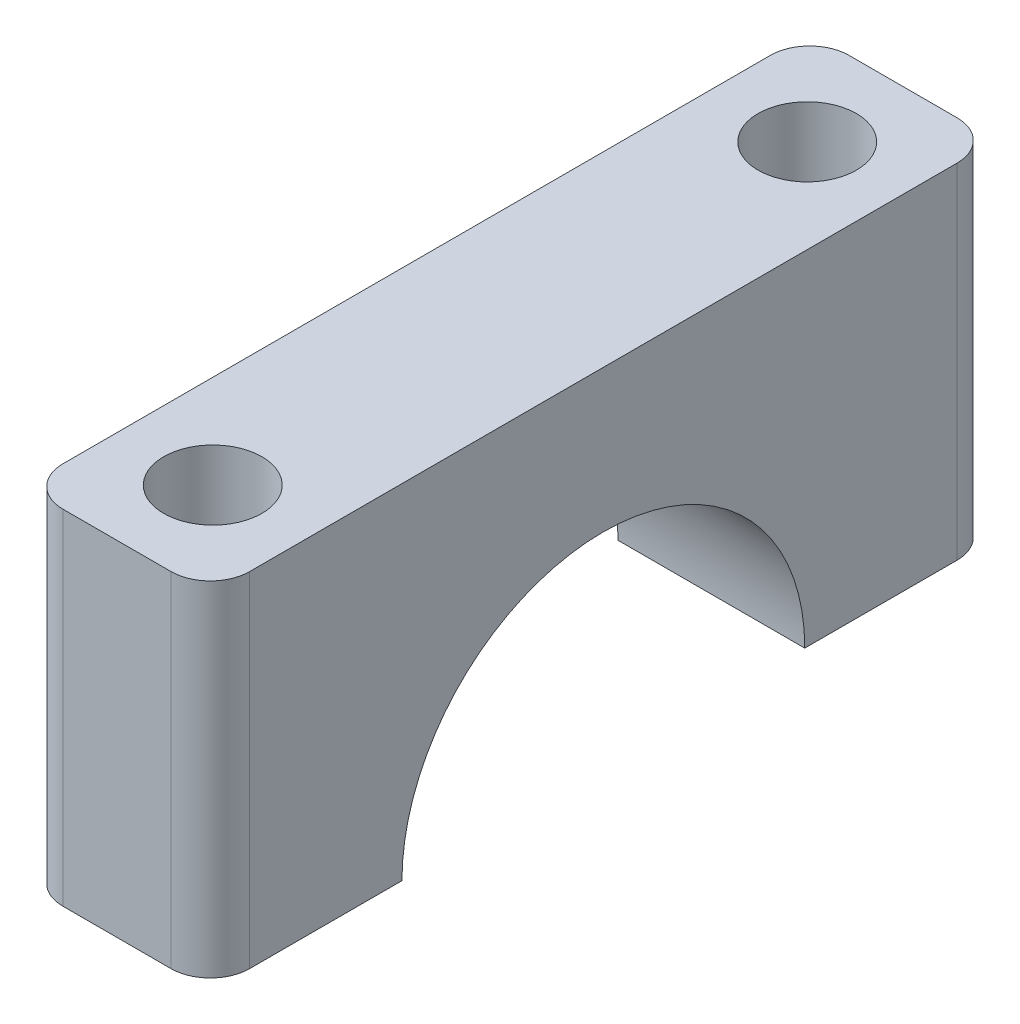
ISO-10303-21;
HEADER;
FILE_DESCRIPTION(('STEP AP214'),'2;1');
FILE_NAME('part.step','',(''),(''),'','','');
FILE_SCHEMA(('AUTOMOTIVE_DESIGN { 1 0 10303 214 1 1 1 1 }'));
ENDSEC;
DATA;
#1=APPLICATION_CONTEXT('core data for automotive mechanical design processes');
#2=APPLICATION_PROTOCOL_DEFINITION('international standard','automotive_design',2000,#1);
#3=PRODUCT_CONTEXT('',#1,'mechanical');
#4=PRODUCT('Part','Part','',(#3));
#5=PRODUCT_RELATED_PRODUCT_CATEGORY('part','',(#4));
#6=PRODUCT_DEFINITION_FORMATION('','',#4);
#7=PRODUCT_DEFINITION_CONTEXT('part definition',#1,'design');
#8=PRODUCT_DEFINITION('design','',#6,#7);
#9=PRODUCT_DEFINITION_SHAPE('','',#8);
#10=(LENGTH_UNIT() NAMED_UNIT(*) SI_UNIT(.MILLI.,.METRE.));
#11=(NAMED_UNIT(*) PLANE_ANGLE_UNIT() SI_UNIT($,.RADIAN.));
#12=(NAMED_UNIT(*) SI_UNIT($,.STERADIAN.) SOLID_ANGLE_UNIT());
#13=UNCERTAINTY_MEASURE_WITH_UNIT(LENGTH_MEASURE(1.E-05),#10,'distance_accuracy_value','');
#14=(GEOMETRIC_REPRESENTATION_CONTEXT(3) GLOBAL_UNCERTAINTY_ASSIGNED_CONTEXT((#13)) GLOBAL_UNIT_ASSIGNED_CONTEXT((#10,
#11,#12)) REPRESENTATION_CONTEXT('',''));
#15=CARTESIAN_POINT('',(0.,0.,0.));
#16=DIRECTION('',(0.,0.,1.));
#17=DIRECTION('',(1.,0.,0.));
#18=AXIS2_PLACEMENT_3D('',#15,#16,#17);
#19=CARTESIAN_POINT('',(0.,0.,0.));
#20=DIRECTION('',(0.,-1.,0.));
#21=DIRECTION('',(0.,0.,-1.));
#22=AXIS2_PLACEMENT_3D('',#19,#20,#21);
#23=PLANE('',#22);
#24=CARTESIAN_POINT('',(0.,0.,-30.25));
#25=DIRECTION('',(0.,-1.,0.));
#26=DIRECTION('',(0.,0.,-1.));
#27=AXIS2_PLACEMENT_3D('',#24,#25,#26);
#28=CIRCLE('',#27,5.);
#29=CARTESIAN_POINT('',(0.,0.,-35.25));
#30=VERTEX_POINT('',#29);
#31=EDGE_CURVE('E288',#30,#30,#28,.T.);
#32=ORIENTED_EDGE('',*,*,#31,.F.);
#33=EDGE_LOOP('',(#32));
#34=FACE_BOUND('',#33,.T.);
#35=DIRECTION('',(0.,0.,1.));
#36=VECTOR('',#35,1.);
#37=CARTESIAN_POINT('',(-9.5,0.,40.));
#38=LINE('',#37,#36);
#39=CARTESIAN_POINT('',(-9.5,0.,-36.));
#40=VERTEX_POINT('',#39);
#41=CARTESIAN_POINT('',(-9.5,0.,-20.5));
#42=VERTEX_POINT('',#41);
#43=EDGE_CURVE('E161',#40,#42,#38,.T.);
#44=ORIENTED_EDGE('',*,*,#43,.F.);
#45=CARTESIAN_POINT('',(-5.5,0.,-36.));
#46=DIRECTION('',(0.,-1.,0.));
#47=DIRECTION('',(0.,0.,-1.));
#48=AXIS2_PLACEMENT_3D('',#45,#46,#47);
#49=CIRCLE('',#48,4.);
#50=CARTESIAN_POINT('',(-5.5,0.,-40.));
#51=VERTEX_POINT('',#50);
#52=EDGE_CURVE('E61',#40,#51,#49,.T.);
#53=ORIENTED_EDGE('',*,*,#52,.T.);
#54=DIRECTION('',(-1.,0.,0.));
#55=VECTOR('',#54,1.);
#56=CARTESIAN_POINT('',(-9.5,0.,-40.));
#57=LINE('',#56,#55);
#58=CARTESIAN_POINT('',(5.5,0.,-40.));
#59=VERTEX_POINT('',#58);
#60=EDGE_CURVE('E152',#59,#51,#57,.T.);
#61=ORIENTED_EDGE('',*,*,#60,.F.);
#62=CARTESIAN_POINT('',(5.5,0.,-36.));
#63=DIRECTION('',(0.,-1.,0.));
#64=DIRECTION('',(0.,0.,-1.));
#65=AXIS2_PLACEMENT_3D('',#62,#63,#64);
#66=CIRCLE('',#65,4.);
#67=CARTESIAN_POINT('',(9.5,0.,-36.));
#68=VERTEX_POINT('',#67);
#69=EDGE_CURVE('E69',#59,#68,#66,.T.);
#70=ORIENTED_EDGE('',*,*,#69,.T.);
#71=DIRECTION('',(0.,0.,-1.));
#72=VECTOR('',#71,1.);
#73=CARTESIAN_POINT('',(9.5,0.,40.));
#74=LINE('',#73,#72);
#75=CARTESIAN_POINT('',(9.5,0.,-20.5));
#76=VERTEX_POINT('',#75);
#77=EDGE_CURVE('E141',#76,#68,#74,.T.);
#78=ORIENTED_EDGE('',*,*,#77,.F.);
#79=DIRECTION('',(1.,0.,0.));
#80=VECTOR('',#79,1.);
#81=CARTESIAN_POINT('',(-25.5,0.,-20.5));
#82=LINE('',#81,#80);
#83=EDGE_CURVE('E125',#42,#76,#82,.T.);
#84=ORIENTED_EDGE('',*,*,#83,.F.);
#85=EDGE_LOOP('',(#44,#53,#61,#70,#78,#84));
#86=FACE_BOUND('',#85,.T.);
#87=ADVANCED_FACE('F45',(#34,#86),#23,.T.);
#88=CARTESIAN_POINT('',(9.5,35.,40.));
#89=DIRECTION('',(-1.,0.,0.));
#90=DIRECTION('',(0.,0.,1.));
#91=AXIS2_PLACEMENT_3D('',#88,#89,#90);
#92=PLANE('',#91);
#93=DIRECTION('',(0.,0.,-1.));
#94=VECTOR('',#93,1.);
#95=CARTESIAN_POINT('',(9.5,35.,40.));
#96=LINE('',#95,#94);
#97=CARTESIAN_POINT('',(9.5,35.,36.));
#98=VERTEX_POINT('',#97);
#99=CARTESIAN_POINT('',(9.5,35.,-36.));
#100=VERTEX_POINT('',#99);
#101=EDGE_CURVE('E168',#98,#100,#96,.T.);
#102=ORIENTED_EDGE('',*,*,#101,.F.);
#103=DIRECTION('',(0.,-1.,0.));
#104=VECTOR('',#103,1.);
#105=CARTESIAN_POINT('',(9.5,35.,36.));
#106=LINE('',#105,#104);
#107=CARTESIAN_POINT('',(9.5,0.,36.));
#108=VERTEX_POINT('',#107);
#109=EDGE_CURVE('E173',#98,#108,#106,.T.);
#110=ORIENTED_EDGE('',*,*,#109,.T.);
#111=CARTESIAN_POINT('',(9.5,0.,20.5));
#112=VERTEX_POINT('',#111);
#113=EDGE_CURVE('E144',#108,#112,#74,.T.);
#114=ORIENTED_EDGE('',*,*,#113,.T.);
#115=CARTESIAN_POINT('',(9.5,0.,0.));
#116=DIRECTION('',(1.,0.,0.));
#117=DIRECTION('',(0.,0.,-1.));
#118=AXIS2_PLACEMENT_3D('',#115,#116,#117);
#119=CIRCLE('',#118,20.5);
#120=EDGE_CURVE('E128',#76,#112,#119,.T.);
#121=ORIENTED_EDGE('',*,*,#120,.F.);
#122=ORIENTED_EDGE('',*,*,#77,.T.);
#123=DIRECTION('',(0.,-1.,0.));
#124=VECTOR('',#123,1.);
#125=CARTESIAN_POINT('',(9.5,35.,-36.));
#126=LINE('',#125,#124);
#127=EDGE_CURVE('E134',#68,#100,#126,.F.);
#128=ORIENTED_EDGE('',*,*,#127,.T.);
#129=EDGE_LOOP('',(#102,#110,#114,#121,#122,#128));
#130=FACE_BOUND('',#129,.T.);
#131=ADVANCED_FACE('F140',(#130),#92,.F.);
#132=CARTESIAN_POINT('',(-9.5,35.,-40.));
#133=DIRECTION('',(0.,0.,1.));
#134=DIRECTION('',(1.,0.,0.));
#135=AXIS2_PLACEMENT_3D('',#132,#133,#134);
#136=PLANE('',#135);
#137=ORIENTED_EDGE('',*,*,#60,.T.);
#138=DIRECTION('',(0.,-1.,0.));
#139=VECTOR('',#138,1.);
#140=CARTESIAN_POINT('',(-5.5,35.,-40.));
#141=LINE('',#140,#139);
#142=CARTESIAN_POINT('',(-5.5,35.,-40.));
#143=VERTEX_POINT('',#142);
#144=EDGE_CURVE('E11',#51,#143,#141,.F.);
#145=ORIENTED_EDGE('',*,*,#144,.T.);
#146=DIRECTION('',(-1.,0.,0.));
#147=VECTOR('',#146,1.);
#148=CARTESIAN_POINT('',(-9.5,35.,-40.));
#149=LINE('',#148,#147);
#150=CARTESIAN_POINT('',(5.5,35.,-40.));
#151=VERTEX_POINT('',#150);
#152=EDGE_CURVE('E217',#151,#143,#149,.T.);
#153=ORIENTED_EDGE('',*,*,#152,.F.);
#154=DIRECTION('',(0.,-1.,0.));
#155=VECTOR('',#154,1.);
#156=CARTESIAN_POINT('',(5.5,35.,-40.));
#157=LINE('',#156,#155);
#158=EDGE_CURVE('E54',#151,#59,#157,.T.);
#159=ORIENTED_EDGE('',*,*,#158,.T.);
#160=EDGE_LOOP('',(#137,#145,#153,#159));
#161=FACE_BOUND('',#160,.T.);
#162=ADVANCED_FACE('F214',(#161),#136,.F.);
#163=CARTESIAN_POINT('',(-9.5,35.,40.));
#164=DIRECTION('',(1.,0.,0.));
#165=DIRECTION('',(0.,0.,-1.));
#166=AXIS2_PLACEMENT_3D('',#163,#164,#165);
#167=PLANE('',#166);
#168=CARTESIAN_POINT('',(-9.5,0.,20.5));
#169=VERTEX_POINT('',#168);
#170=CARTESIAN_POINT('',(-9.5,0.,36.));
#171=VERTEX_POINT('',#170);
#172=EDGE_CURVE('E160',#169,#171,#38,.T.);
#173=ORIENTED_EDGE('',*,*,#172,.T.);
#174=DIRECTION('',(0.,-1.,0.));
#175=VECTOR('',#174,1.);
#176=CARTESIAN_POINT('',(-9.5,35.,36.));
#177=LINE('',#176,#175);
#178=CARTESIAN_POINT('',(-9.5,35.,36.));
#179=VERTEX_POINT('',#178);
#180=EDGE_CURVE('E205',#171,#179,#177,.F.);
#181=ORIENTED_EDGE('',*,*,#180,.T.);
#182=DIRECTION('',(0.,0.,1.));
#183=VECTOR('',#182,1.);
#184=CARTESIAN_POINT('',(-9.5,35.,40.));
#185=LINE('',#184,#183);
#186=CARTESIAN_POINT('',(-9.5,35.,-36.));
#187=VERTEX_POINT('',#186);
#188=EDGE_CURVE('E229',#187,#179,#185,.T.);
#189=ORIENTED_EDGE('',*,*,#188,.F.);
#190=DIRECTION('',(0.,-1.,0.));
#191=VECTOR('',#190,1.);
#192=CARTESIAN_POINT('',(-9.5,35.,-36.));
#193=LINE('',#192,#191);
#194=EDGE_CURVE('E201',#187,#40,#193,.T.);
#195=ORIENTED_EDGE('',*,*,#194,.T.);
#196=ORIENTED_EDGE('',*,*,#43,.T.);
#197=CARTESIAN_POINT('',(-9.5,0.,0.));
#198=DIRECTION('',(1.,0.,0.));
#199=DIRECTION('',(0.,0.,-1.));
#200=AXIS2_PLACEMENT_3D('',#197,#198,#199);
#201=CIRCLE('',#200,20.5);
#202=EDGE_CURVE('E131',#42,#169,#201,.T.);
#203=ORIENTED_EDGE('',*,*,#202,.T.);
#204=EDGE_LOOP('',(#173,#181,#189,#195,#196,#203));
#205=FACE_BOUND('',#204,.T.);
#206=ADVANCED_FACE('F248',(#205),#167,.F.);
#207=CARTESIAN_POINT('',(-9.5,35.,40.));
#208=DIRECTION('',(0.,0.,-1.));
#209=DIRECTION('',(-1.,0.,0.));
#210=AXIS2_PLACEMENT_3D('',#207,#208,#209);
#211=PLANE('',#210);
#212=DIRECTION('',(1.,0.,0.));
#213=VECTOR('',#212,1.);
#214=CARTESIAN_POINT('',(-9.5,0.,40.));
#215=LINE('',#214,#213);
#216=CARTESIAN_POINT('',(-5.5,0.,40.));
#217=VERTEX_POINT('',#216);
#218=CARTESIAN_POINT('',(5.5,0.,40.));
#219=VERTEX_POINT('',#218);
#220=EDGE_CURVE('E164',#217,#219,#215,.T.);
#221=ORIENTED_EDGE('',*,*,#220,.T.);
#222=DIRECTION('',(0.,-1.,0.));
#223=VECTOR('',#222,1.);
#224=CARTESIAN_POINT('',(5.5,35.,40.));
#225=LINE('',#224,#223);
#226=CARTESIAN_POINT('',(5.5,35.,40.));
#227=VERTEX_POINT('',#226);
#228=EDGE_CURVE('E186',#219,#227,#225,.F.);
#229=ORIENTED_EDGE('',*,*,#228,.T.);
#230=DIRECTION('',(1.,0.,0.));
#231=VECTOR('',#230,1.);
#232=CARTESIAN_POINT('',(-9.5,35.,40.));
#233=LINE('',#232,#231);
#234=CARTESIAN_POINT('',(-5.5,35.,40.));
#235=VERTEX_POINT('',#234);
#236=EDGE_CURVE('E156',#235,#227,#233,.T.);
#237=ORIENTED_EDGE('',*,*,#236,.F.);
#238=DIRECTION('',(0.,-1.,0.));
#239=VECTOR('',#238,1.);
#240=CARTESIAN_POINT('',(-5.5,35.,40.));
#241=LINE('',#240,#239);
#242=EDGE_CURVE('E182',#235,#217,#241,.T.);
#243=ORIENTED_EDGE('',*,*,#242,.T.);
#244=EDGE_LOOP('',(#221,#229,#237,#243));
#245=FACE_BOUND('',#244,.T.);
#246=ADVANCED_FACE('F281',(#245),#211,.F.);
#247=CARTESIAN_POINT('',(0.,35.,0.));
#248=DIRECTION('',(0.,-1.,0.));
#249=DIRECTION('',(0.,0.,-1.));
#250=AXIS2_PLACEMENT_3D('',#247,#248,#249);
#251=PLANE('',#250);
#252=CARTESIAN_POINT('',(0.,35.,-30.25));
#253=DIRECTION('',(0.,-1.,0.));
#254=DIRECTION('',(0.,0.,-1.));
#255=AXIS2_PLACEMENT_3D('',#252,#253,#254);
#256=CIRCLE('',#255,5.);
#257=CARTESIAN_POINT('',(0.,35.,-35.25));
#258=VERTEX_POINT('',#257);
#259=EDGE_CURVE('E146',#258,#258,#256,.T.);
#260=ORIENTED_EDGE('',*,*,#259,.T.);
#261=EDGE_LOOP('',(#260));
#262=FACE_BOUND('',#261,.T.);
#263=CARTESIAN_POINT('',(0.,35.,30.25));
#264=DIRECTION('',(0.,-1.,0.));
#265=DIRECTION('',(0.,0.,-1.));
#266=AXIS2_PLACEMENT_3D('',#263,#264,#265);
#267=CIRCLE('',#266,5.);
#268=CARTESIAN_POINT('',(0.,35.,25.25));
#269=VERTEX_POINT('',#268);
#270=EDGE_CURVE('E289',#269,#269,#267,.T.);
#271=ORIENTED_EDGE('',*,*,#270,.T.);
#272=EDGE_LOOP('',(#271));
#273=FACE_BOUND('',#272,.T.);
#274=ORIENTED_EDGE('',*,*,#236,.T.);
#275=CARTESIAN_POINT('',(5.5,35.,36.));
#276=DIRECTION('',(0.,-1.,0.));
#277=DIRECTION('',(0.,0.,-1.));
#278=AXIS2_PLACEMENT_3D('',#275,#276,#277);
#279=CIRCLE('',#278,4.);
#280=EDGE_CURVE('E198',#227,#98,#279,.F.);
#281=ORIENTED_EDGE('',*,*,#280,.T.);
#282=ORIENTED_EDGE('',*,*,#101,.T.);
#283=CARTESIAN_POINT('',(5.5,35.,-36.));
#284=DIRECTION('',(0.,-1.,0.));
#285=DIRECTION('',(0.,0.,-1.));
#286=AXIS2_PLACEMENT_3D('',#283,#284,#285);
#287=CIRCLE('',#286,4.);
#288=EDGE_CURVE('E189',#100,#151,#287,.F.);
#289=ORIENTED_EDGE('',*,*,#288,.T.);
#290=ORIENTED_EDGE('',*,*,#152,.T.);
#291=CARTESIAN_POINT('',(-5.5,35.,-36.));
#292=DIRECTION('',(0.,-1.,0.));
#293=DIRECTION('',(0.,0.,-1.));
#294=AXIS2_PLACEMENT_3D('',#291,#292,#293);
#295=CIRCLE('',#294,4.);
#296=EDGE_CURVE('E192',#143,#187,#295,.F.);
#297=ORIENTED_EDGE('',*,*,#296,.T.);
#298=ORIENTED_EDGE('',*,*,#188,.T.);
#299=CARTESIAN_POINT('',(-5.5,35.,36.));
#300=DIRECTION('',(0.,-1.,0.));
#301=DIRECTION('',(0.,0.,-1.));
#302=AXIS2_PLACEMENT_3D('',#299,#300,#301);
#303=CIRCLE('',#302,4.);
#304=EDGE_CURVE('E195',#179,#235,#303,.F.);
#305=ORIENTED_EDGE('',*,*,#304,.T.);
#306=EDGE_LOOP('',(#274,#281,#282,#289,#290,#297,#298,#305));
#307=FACE_BOUND('',#306,.T.);
#308=ADVANCED_FACE('F222',(#262,#273,#307),#251,.F.);
#309=CARTESIAN_POINT('',(0.,0.,30.25));
#310=DIRECTION('',(0.,-1.,0.));
#311=DIRECTION('',(0.,0.,-1.));
#312=AXIS2_PLACEMENT_3D('',#309,#310,#311);
#313=CIRCLE('',#312,5.);
#314=CARTESIAN_POINT('',(0.,0.,25.25));
#315=VERTEX_POINT('',#314);
#316=EDGE_CURVE('E285',#315,#315,#313,.T.);
#317=ORIENTED_EDGE('',*,*,#316,.F.);
#318=EDGE_LOOP('',(#317));
#319=FACE_BOUND('',#318,.T.);
#320=ORIENTED_EDGE('',*,*,#113,.F.);
#321=CARTESIAN_POINT('',(5.5,0.,36.));
#322=DIRECTION('',(0.,-1.,0.));
#323=DIRECTION('',(0.,0.,-1.));
#324=AXIS2_PLACEMENT_3D('',#321,#322,#323);
#325=CIRCLE('',#324,4.);
#326=EDGE_CURVE('E179',#108,#219,#325,.T.);
#327=ORIENTED_EDGE('',*,*,#326,.T.);
#328=ORIENTED_EDGE('',*,*,#220,.F.);
#329=CARTESIAN_POINT('',(-5.5,0.,36.));
#330=DIRECTION('',(0.,-1.,0.));
#331=DIRECTION('',(0.,0.,-1.));
#332=AXIS2_PLACEMENT_3D('',#329,#330,#331);
#333=CIRCLE('',#332,4.);
#334=EDGE_CURVE('E176',#217,#171,#333,.T.);
#335=ORIENTED_EDGE('',*,*,#334,.T.);
#336=ORIENTED_EDGE('',*,*,#172,.F.);
#337=DIRECTION('',(1.,0.,0.));
#338=VECTOR('',#337,1.);
#339=CARTESIAN_POINT('',(-25.5,0.,20.5));
#340=LINE('',#339,#338);
#341=EDGE_CURVE('E135',#112,#169,#340,.F.);
#342=ORIENTED_EDGE('',*,*,#341,.F.);
#343=EDGE_LOOP('',(#320,#327,#328,#335,#336,#342));
#344=FACE_BOUND('',#343,.T.);
#345=ADVANCED_FACE('F243',(#319,#344),#23,.T.);
#346=CARTESIAN_POINT('',(-25.5,0.,0.));
#347=DIRECTION('',(1.,0.,0.));
#348=DIRECTION('',(0.,0.,-1.));
#349=AXIS2_PLACEMENT_3D('',#346,#347,#348);
#350=CYLINDRICAL_SURFACE('',#349,20.5);
#351=ORIENTED_EDGE('',*,*,#83,.T.);
#352=ORIENTED_EDGE('',*,*,#120,.T.);
#353=ORIENTED_EDGE('',*,*,#341,.T.);
#354=ORIENTED_EDGE('',*,*,#202,.F.);
#355=EDGE_LOOP('',(#351,#352,#353,#354));
#356=FACE_BOUND('',#355,.T.);
#357=ADVANCED_FACE('F127',(#356),#350,.F.);
#358=CARTESIAN_POINT('',(0.,35.,30.25));
#359=DIRECTION('',(0.,-1.,0.));
#360=DIRECTION('',(0.,0.,-1.));
#361=AXIS2_PLACEMENT_3D('',#358,#359,#360);
#362=CYLINDRICAL_SURFACE('',#361,5.);
#363=ORIENTED_EDGE('',*,*,#270,.F.);
#364=EDGE_LOOP('',(#363));
#365=FACE_BOUND('',#364,.T.);
#366=ORIENTED_EDGE('',*,*,#316,.T.);
#367=EDGE_LOOP('',(#366));
#368=FACE_BOUND('',#367,.T.);
#369=ADVANCED_FACE('F279',(#365,#368),#362,.F.);
#370=CARTESIAN_POINT('',(0.,35.,-30.25));
#371=DIRECTION('',(0.,-1.,0.));
#372=DIRECTION('',(0.,0.,-1.));
#373=AXIS2_PLACEMENT_3D('',#370,#371,#372);
#374=CYLINDRICAL_SURFACE('',#373,5.);
#375=ORIENTED_EDGE('',*,*,#259,.F.);
#376=EDGE_LOOP('',(#375));
#377=FACE_BOUND('',#376,.T.);
#378=ORIENTED_EDGE('',*,*,#31,.T.);
#379=EDGE_LOOP('',(#378));
#380=FACE_BOUND('',#379,.T.);
#381=ADVANCED_FACE('F303',(#377,#380),#374,.F.);
#382=CARTESIAN_POINT('',(5.5,35.,36.));
#383=DIRECTION('',(0.,-1.,0.));
#384=DIRECTION('',(0.,0.,-1.));
#385=AXIS2_PLACEMENT_3D('',#382,#383,#384);
#386=CYLINDRICAL_SURFACE('',#385,4.);
#387=ORIENTED_EDGE('',*,*,#280,.F.);
#388=ORIENTED_EDGE('',*,*,#228,.F.);
#389=ORIENTED_EDGE('',*,*,#326,.F.);
#390=ORIENTED_EDGE('',*,*,#109,.F.);
#391=EDGE_LOOP('',(#387,#388,#389,#390));
#392=FACE_BOUND('',#391,.T.);
#393=ADVANCED_FACE('F241',(#392),#386,.T.);
#394=CARTESIAN_POINT('',(-5.5,35.,36.));
#395=DIRECTION('',(0.,-1.,0.));
#396=DIRECTION('',(0.,0.,-1.));
#397=AXIS2_PLACEMENT_3D('',#394,#395,#396);
#398=CYLINDRICAL_SURFACE('',#397,4.);
#399=ORIENTED_EDGE('',*,*,#304,.F.);
#400=ORIENTED_EDGE('',*,*,#180,.F.);
#401=ORIENTED_EDGE('',*,*,#334,.F.);
#402=ORIENTED_EDGE('',*,*,#242,.F.);
#403=EDGE_LOOP('',(#399,#400,#401,#402));
#404=FACE_BOUND('',#403,.T.);
#405=ADVANCED_FACE('F254',(#404),#398,.T.);
#406=CARTESIAN_POINT('',(-5.5,35.,-36.));
#407=DIRECTION('',(0.,-1.,0.));
#408=DIRECTION('',(0.,0.,-1.));
#409=AXIS2_PLACEMENT_3D('',#406,#407,#408);
#410=CYLINDRICAL_SURFACE('',#409,4.);
#411=ORIENTED_EDGE('',*,*,#296,.F.);
#412=ORIENTED_EDGE('',*,*,#144,.F.);
#413=ORIENTED_EDGE('',*,*,#52,.F.);
#414=ORIENTED_EDGE('',*,*,#194,.F.);
#415=EDGE_LOOP('',(#411,#412,#413,#414));
#416=FACE_BOUND('',#415,.T.);
#417=ADVANCED_FACE('F252',(#416),#410,.T.);
#418=CARTESIAN_POINT('',(5.5,35.,-36.));
#419=DIRECTION('',(0.,-1.,0.));
#420=DIRECTION('',(0.,0.,-1.));
#421=AXIS2_PLACEMENT_3D('',#418,#419,#420);
#422=CYLINDRICAL_SURFACE('',#421,4.);
#423=ORIENTED_EDGE('',*,*,#288,.F.);
#424=ORIENTED_EDGE('',*,*,#127,.F.);
#425=ORIENTED_EDGE('',*,*,#69,.F.);
#426=ORIENTED_EDGE('',*,*,#158,.F.);
#427=EDGE_LOOP('',(#423,#424,#425,#426));
#428=FACE_BOUND('',#427,.T.);
#429=ADVANCED_FACE('F47',(#428),#422,.T.);
#430=CLOSED_SHELL('',(#87,#131,#162,#206,#246,#308,#345,#357,#369,#381,#393,#405,#417,#429));
#431=MANIFOLD_SOLID_BREP('B2',#430);
#432=ADVANCED_BREP_SHAPE_REPRESENTATION('',(#18,#431),#14);
#433=SHAPE_DEFINITION_REPRESENTATION(#9,#432);
ENDSEC;
END-ISO-10303-21;
